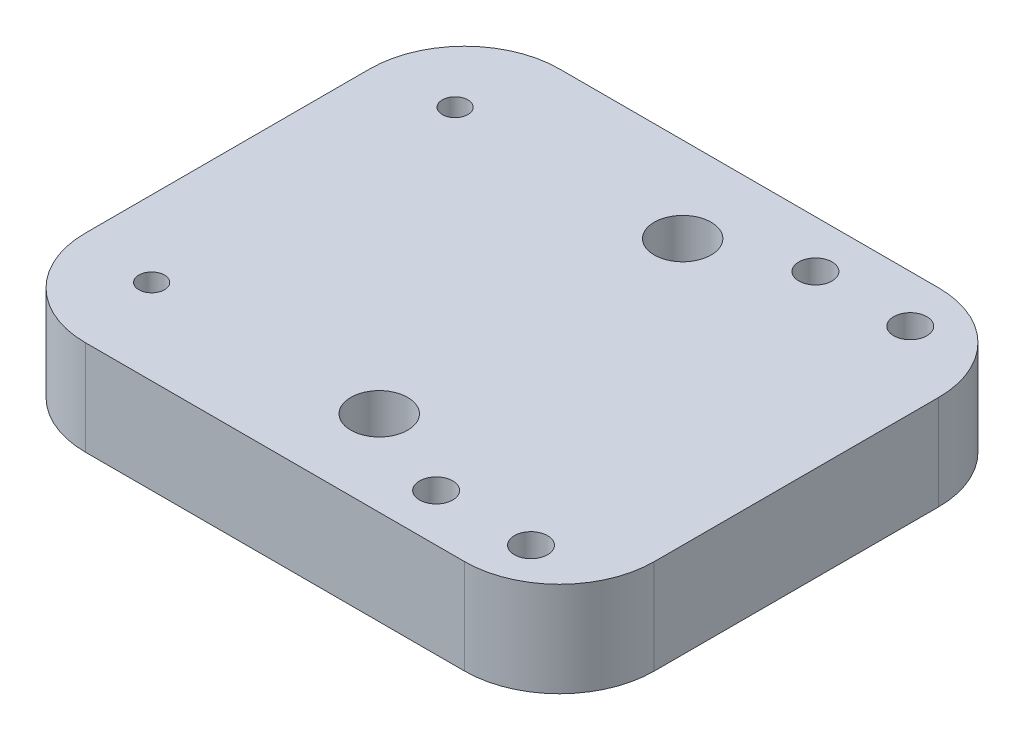
ISO-10303-21;
HEADER;
FILE_DESCRIPTION(('STEP AP214'),'2;1');
FILE_NAME('part.step','',(''),(''),'','','');
FILE_SCHEMA(('AUTOMOTIVE_DESIGN { 1 0 10303 214 1 1 1 1 }'));
ENDSEC;
DATA;
#1=APPLICATION_CONTEXT('core data for automotive mechanical design processes');
#2=APPLICATION_PROTOCOL_DEFINITION('international standard','automotive_design',2000,#1);
#3=PRODUCT_CONTEXT('',#1,'mechanical');
#4=PRODUCT('Part','Part','',(#3));
#5=PRODUCT_RELATED_PRODUCT_CATEGORY('part','',(#4));
#6=PRODUCT_DEFINITION_FORMATION('','',#4);
#7=PRODUCT_DEFINITION_CONTEXT('part definition',#1,'design');
#8=PRODUCT_DEFINITION('design','',#6,#7);
#9=PRODUCT_DEFINITION_SHAPE('','',#8);
#10=(LENGTH_UNIT() NAMED_UNIT(*) SI_UNIT(.MILLI.,.METRE.));
#11=(NAMED_UNIT(*) PLANE_ANGLE_UNIT() SI_UNIT($,.RADIAN.));
#12=(NAMED_UNIT(*) SI_UNIT($,.STERADIAN.) SOLID_ANGLE_UNIT());
#13=UNCERTAINTY_MEASURE_WITH_UNIT(LENGTH_MEASURE(1.E-05),#10,'distance_accuracy_value','');
#14=(GEOMETRIC_REPRESENTATION_CONTEXT(3) GLOBAL_UNCERTAINTY_ASSIGNED_CONTEXT((#13)) GLOBAL_UNIT_ASSIGNED_CONTEXT((#10,
#11,#12)) REPRESENTATION_CONTEXT('',''));
#15=CARTESIAN_POINT('',(0.,0.,0.));
#16=DIRECTION('',(0.,0.,1.));
#17=DIRECTION('',(1.,0.,0.));
#18=AXIS2_PLACEMENT_3D('',#15,#16,#17);
#19=CARTESIAN_POINT('',(32.,0.,-41.));
#20=DIRECTION('',(0.,1.,0.));
#21=DIRECTION('',(0.,0.,1.));
#22=AXIS2_PLACEMENT_3D('',#19,#20,#21);
#23=CYLINDRICAL_SURFACE('',#22,1.35);
#24=CARTESIAN_POINT('',(32.,0.,-41.));
#25=DIRECTION('',(0.,1.,0.));
#26=DIRECTION('',(0.,0.,1.));
#27=AXIS2_PLACEMENT_3D('',#24,#25,#26);
#28=CIRCLE('',#27,1.35);
#29=CARTESIAN_POINT('',(32.,0.,-39.65));
#30=VERTEX_POINT('',#29);
#31=EDGE_CURVE('E208',#30,#30,#28,.T.);
#32=ORIENTED_EDGE('',*,*,#31,.F.);
#33=EDGE_LOOP('',(#32));
#34=FACE_BOUND('',#33,.T.);
#35=CARTESIAN_POINT('',(32.,5.,-41.));
#36=DIRECTION('',(0.,1.,0.));
#37=DIRECTION('',(0.,0.,1.));
#38=AXIS2_PLACEMENT_3D('',#35,#36,#37);
#39=CIRCLE('',#38,1.35);
#40=CARTESIAN_POINT('',(32.,5.,-39.65));
#41=VERTEX_POINT('',#40);
#42=EDGE_CURVE('E43',#41,#41,#39,.F.);
#43=ORIENTED_EDGE('',*,*,#42,.F.);
#44=EDGE_LOOP('',(#43));
#45=FACE_BOUND('',#44,.T.);
#46=ADVANCED_FACE('F39',(#34,#45),#23,.F.);
#47=CARTESIAN_POINT('',(32.,0.,-9.));
#48=DIRECTION('',(0.,1.,0.));
#49=DIRECTION('',(0.,0.,1.));
#50=AXIS2_PLACEMENT_3D('',#47,#48,#49);
#51=CYLINDRICAL_SURFACE('',#50,1.35);
#52=CARTESIAN_POINT('',(32.,0.,-9.));
#53=DIRECTION('',(0.,1.,0.));
#54=DIRECTION('',(0.,0.,1.));
#55=AXIS2_PLACEMENT_3D('',#52,#53,#54);
#56=CIRCLE('',#55,1.35);
#57=CARTESIAN_POINT('',(32.,0.,-7.65));
#58=VERTEX_POINT('',#57);
#59=EDGE_CURVE('E213',#58,#58,#56,.T.);
#60=ORIENTED_EDGE('',*,*,#59,.F.);
#61=EDGE_LOOP('',(#60));
#62=FACE_BOUND('',#61,.T.);
#63=CARTESIAN_POINT('',(32.,5.,-9.));
#64=DIRECTION('',(0.,1.,0.));
#65=DIRECTION('',(0.,0.,1.));
#66=AXIS2_PLACEMENT_3D('',#63,#64,#65);
#67=CIRCLE('',#66,1.35);
#68=CARTESIAN_POINT('',(32.,5.,-7.65));
#69=VERTEX_POINT('',#68);
#70=EDGE_CURVE('E166',#69,#69,#67,.F.);
#71=ORIENTED_EDGE('',*,*,#70,.F.);
#72=EDGE_LOOP('',(#71));
#73=FACE_BOUND('',#72,.T.);
#74=ADVANCED_FACE('F260',(#62,#73),#51,.F.);
#75=CARTESIAN_POINT('',(0.,10.,0.));
#76=DIRECTION('',(1.,0.,0.));
#77=DIRECTION('',(0.,0.,-1.));
#78=AXIS2_PLACEMENT_3D('',#75,#76,#77);
#79=PLANE('',#78);
#80=DIRECTION('',(0.,0.,1.));
#81=VECTOR('',#80,1.);
#82=CARTESIAN_POINT('',(0.,0.,0.));
#83=LINE('',#82,#81);
#84=CARTESIAN_POINT('',(0.,0.,-40.));
#85=VERTEX_POINT('',#84);
#86=CARTESIAN_POINT('',(0.,0.,-10.));
#87=VERTEX_POINT('',#86);
#88=EDGE_CURVE('E134',#85,#87,#83,.T.);
#89=ORIENTED_EDGE('',*,*,#88,.T.);
#90=DIRECTION('',(0.,-1.,0.));
#91=VECTOR('',#90,1.);
#92=CARTESIAN_POINT('',(0.,10.,-10.));
#93=LINE('',#92,#91);
#94=CARTESIAN_POINT('',(0.,10.,-10.));
#95=VERTEX_POINT('',#94);
#96=EDGE_CURVE('E112',#87,#95,#93,.F.);
#97=ORIENTED_EDGE('',*,*,#96,.T.);
#98=DIRECTION('',(0.,0.,1.));
#99=VECTOR('',#98,1.);
#100=CARTESIAN_POINT('',(0.,10.,0.));
#101=LINE('',#100,#99);
#102=CARTESIAN_POINT('',(0.,10.,-40.));
#103=VERTEX_POINT('',#102);
#104=EDGE_CURVE('E144',#103,#95,#101,.T.);
#105=ORIENTED_EDGE('',*,*,#104,.F.);
#106=DIRECTION('',(0.,-1.,0.));
#107=VECTOR('',#106,1.);
#108=CARTESIAN_POINT('',(0.,10.,-40.));
#109=LINE('',#108,#107);
#110=EDGE_CURVE('E117',#103,#85,#109,.T.);
#111=ORIENTED_EDGE('',*,*,#110,.T.);
#112=EDGE_LOOP('',(#89,#97,#105,#111));
#113=FACE_BOUND('',#112,.T.);
#114=ADVANCED_FACE('F238',(#113),#79,.F.);
#115=CARTESIAN_POINT('',(0.,10.,0.));
#116=DIRECTION('',(0.,0.,-1.));
#117=DIRECTION('',(-1.,0.,0.));
#118=AXIS2_PLACEMENT_3D('',#115,#116,#117);
#119=PLANE('',#118);
#120=DIRECTION('',(1.,0.,0.));
#121=VECTOR('',#120,1.);
#122=CARTESIAN_POINT('',(0.,10.,0.));
#123=LINE('',#122,#121);
#124=CARTESIAN_POINT('',(10.,10.,0.));
#125=VERTEX_POINT('',#124);
#126=CARTESIAN_POINT('',(50.,10.,0.));
#127=VERTEX_POINT('',#126);
#128=EDGE_CURVE('E127',#125,#127,#123,.T.);
#129=ORIENTED_EDGE('',*,*,#128,.F.);
#130=DIRECTION('',(0.,-1.,0.));
#131=VECTOR('',#130,1.);
#132=CARTESIAN_POINT('',(10.,10.,0.));
#133=LINE('',#132,#131);
#134=CARTESIAN_POINT('',(10.,0.,0.));
#135=VERTEX_POINT('',#134);
#136=EDGE_CURVE('E111',#125,#135,#133,.T.);
#137=ORIENTED_EDGE('',*,*,#136,.T.);
#138=DIRECTION('',(1.,0.,0.));
#139=VECTOR('',#138,1.);
#140=CARTESIAN_POINT('',(0.,0.,0.));
#141=LINE('',#140,#139);
#142=CARTESIAN_POINT('',(50.,0.,0.));
#143=VERTEX_POINT('',#142);
#144=EDGE_CURVE('E124',#135,#143,#141,.T.);
#145=ORIENTED_EDGE('',*,*,#144,.T.);
#146=DIRECTION('',(0.,-1.,0.));
#147=VECTOR('',#146,1.);
#148=CARTESIAN_POINT('',(50.,10.,0.));
#149=LINE('',#148,#147);
#150=EDGE_CURVE('E129',#143,#127,#149,.F.);
#151=ORIENTED_EDGE('',*,*,#150,.T.);
#152=EDGE_LOOP('',(#129,#137,#145,#151));
#153=FACE_BOUND('',#152,.T.);
#154=ADVANCED_FACE('F123',(#153),#119,.F.);
#155=CARTESIAN_POINT('',(60.,10.,0.));
#156=DIRECTION('',(-1.,0.,0.));
#157=DIRECTION('',(0.,0.,1.));
#158=AXIS2_PLACEMENT_3D('',#155,#156,#157);
#159=PLANE('',#158);
#160=DIRECTION('',(0.,0.,-1.));
#161=VECTOR('',#160,1.);
#162=CARTESIAN_POINT('',(60.,10.,0.));
#163=LINE('',#162,#161);
#164=CARTESIAN_POINT('',(60.,10.,-10.));
#165=VERTEX_POINT('',#164);
#166=CARTESIAN_POINT('',(60.,10.,-40.));
#167=VERTEX_POINT('',#166);
#168=EDGE_CURVE('E230',#165,#167,#163,.T.);
#169=ORIENTED_EDGE('',*,*,#168,.F.);
#170=DIRECTION('',(0.,-1.,0.));
#171=VECTOR('',#170,1.);
#172=CARTESIAN_POINT('',(60.,10.,-10.));
#173=LINE('',#172,#171);
#174=CARTESIAN_POINT('',(60.,0.,-10.));
#175=VERTEX_POINT('',#174);
#176=EDGE_CURVE('E163',#165,#175,#173,.T.);
#177=ORIENTED_EDGE('',*,*,#176,.T.);
#178=DIRECTION('',(0.,0.,-1.));
#179=VECTOR('',#178,1.);
#180=CARTESIAN_POINT('',(60.,0.,0.));
#181=LINE('',#180,#179);
#182=CARTESIAN_POINT('',(60.,0.,-40.));
#183=VERTEX_POINT('',#182);
#184=EDGE_CURVE('E133',#175,#183,#181,.T.);
#185=ORIENTED_EDGE('',*,*,#184,.T.);
#186=DIRECTION('',(0.,-1.,0.));
#187=VECTOR('',#186,1.);
#188=CARTESIAN_POINT('',(60.,10.,-40.));
#189=LINE('',#188,#187);
#190=EDGE_CURVE('E161',#183,#167,#189,.F.);
#191=ORIENTED_EDGE('',*,*,#190,.T.);
#192=EDGE_LOOP('',(#169,#177,#185,#191));
#193=FACE_BOUND('',#192,.T.);
#194=ADVANCED_FACE('F246',(#193),#159,.F.);
#195=CARTESIAN_POINT('',(0.,10.,-50.));
#196=DIRECTION('',(0.,0.,1.));
#197=DIRECTION('',(1.,0.,0.));
#198=AXIS2_PLACEMENT_3D('',#195,#196,#197);
#199=PLANE('',#198);
#200=DIRECTION('',(-1.,0.,0.));
#201=VECTOR('',#200,1.);
#202=CARTESIAN_POINT('',(0.,10.,-50.));
#203=LINE('',#202,#201);
#204=CARTESIAN_POINT('',(50.,10.,-50.));
#205=VERTEX_POINT('',#204);
#206=CARTESIAN_POINT('',(9.99999999999998,10.,-50.));
#207=VERTEX_POINT('',#206);
#208=EDGE_CURVE('E145',#205,#207,#203,.T.);
#209=ORIENTED_EDGE('',*,*,#208,.F.);
#210=DIRECTION('',(0.,-1.,0.));
#211=VECTOR('',#210,1.);
#212=CARTESIAN_POINT('',(50.,10.,-50.));
#213=LINE('',#212,#211);
#214=CARTESIAN_POINT('',(50.,0.,-50.));
#215=VERTEX_POINT('',#214);
#216=EDGE_CURVE('E11',#205,#215,#213,.T.);
#217=ORIENTED_EDGE('',*,*,#216,.T.);
#218=DIRECTION('',(-1.,0.,0.));
#219=VECTOR('',#218,1.);
#220=CARTESIAN_POINT('',(0.,0.,-50.));
#221=LINE('',#220,#219);
#222=CARTESIAN_POINT('',(9.99999999999998,0.,-50.));
#223=VERTEX_POINT('',#222);
#224=EDGE_CURVE('E137',#215,#223,#221,.T.);
#225=ORIENTED_EDGE('',*,*,#224,.T.);
#226=DIRECTION('',(0.,-1.,0.));
#227=VECTOR('',#226,1.);
#228=CARTESIAN_POINT('',(9.99999999999998,10.,-50.));
#229=LINE('',#228,#227);
#230=EDGE_CURVE('E48',#223,#207,#229,.F.);
#231=ORIENTED_EDGE('',*,*,#230,.T.);
#232=EDGE_LOOP('',(#209,#217,#225,#231));
#233=FACE_BOUND('',#232,.T.);
#234=ADVANCED_FACE('F240',(#233),#199,.F.);
#235=CARTESIAN_POINT('',(0.,10.,0.));
#236=DIRECTION('',(0.,-1.,0.));
#237=DIRECTION('',(0.,0.,-1.));
#238=AXIS2_PLACEMENT_3D('',#235,#236,#237);
#239=PLANE('',#238);
#240=CARTESIAN_POINT('',(32.,10.,-41.));
#241=DIRECTION('',(0.,1.,0.));
#242=DIRECTION('',(0.,0.,1.));
#243=AXIS2_PLACEMENT_3D('',#240,#241,#242);
#244=CIRCLE('',#243,3.);
#245=CARTESIAN_POINT('',(32.,10.,-38.));
#246=VERTEX_POINT('',#245);
#247=EDGE_CURVE('E174',#246,#246,#244,.T.);
#248=ORIENTED_EDGE('',*,*,#247,.F.);
#249=EDGE_LOOP('',(#248));
#250=FACE_BOUND('',#249,.T.);
#251=CARTESIAN_POINT('',(32.,10.,-9.));
#252=DIRECTION('',(0.,1.,0.));
#253=DIRECTION('',(0.,0.,1.));
#254=AXIS2_PLACEMENT_3D('',#251,#252,#253);
#255=CIRCLE('',#254,3.);
#256=CARTESIAN_POINT('',(32.,10.,-6.));
#257=VERTEX_POINT('',#256);
#258=EDGE_CURVE('E179',#257,#257,#255,.T.);
#259=ORIENTED_EDGE('',*,*,#258,.F.);
#260=EDGE_LOOP('',(#259));
#261=FACE_BOUND('',#260,.T.);
#262=CARTESIAN_POINT('',(42.,10.,-5.00000000000001));
#263=DIRECTION('',(0.,1.,0.));
#264=DIRECTION('',(0.,0.,1.));
#265=AXIS2_PLACEMENT_3D('',#262,#263,#264);
#266=CIRCLE('',#265,1.74999999999999);
#267=CARTESIAN_POINT('',(42.,10.,-3.25000000000002));
#268=VERTEX_POINT('',#267);
#269=EDGE_CURVE('E172',#268,#268,#266,.T.);
#270=ORIENTED_EDGE('',*,*,#269,.F.);
#271=EDGE_LOOP('',(#270));
#272=FACE_BOUND('',#271,.T.);
#273=CARTESIAN_POINT('',(52.,10.,-5.));
#274=DIRECTION('',(0.,1.,0.));
#275=DIRECTION('',(0.,0.,1.));
#276=AXIS2_PLACEMENT_3D('',#273,#274,#275);
#277=CIRCLE('',#276,1.74999999999999);
#278=CARTESIAN_POINT('',(52.,10.,-3.25000000000001));
#279=VERTEX_POINT('',#278);
#280=EDGE_CURVE('E197',#279,#279,#277,.T.);
#281=ORIENTED_EDGE('',*,*,#280,.F.);
#282=EDGE_LOOP('',(#281));
#283=FACE_BOUND('',#282,.T.);
#284=CARTESIAN_POINT('',(52.,10.,-45.));
#285=DIRECTION('',(0.,1.,0.));
#286=DIRECTION('',(0.,0.,1.));
#287=AXIS2_PLACEMENT_3D('',#284,#285,#286);
#288=CIRCLE('',#287,1.74999999999999);
#289=CARTESIAN_POINT('',(52.,10.,-43.25));
#290=VERTEX_POINT('',#289);
#291=EDGE_CURVE('E191',#290,#290,#288,.T.);
#292=ORIENTED_EDGE('',*,*,#291,.F.);
#293=EDGE_LOOP('',(#292));
#294=FACE_BOUND('',#293,.T.);
#295=CARTESIAN_POINT('',(42.,10.,-45.));
#296=DIRECTION('',(0.,1.,0.));
#297=DIRECTION('',(0.,0.,1.));
#298=AXIS2_PLACEMENT_3D('',#295,#296,#297);
#299=CIRCLE('',#298,1.74999999999999);
#300=CARTESIAN_POINT('',(42.,10.,-43.25));
#301=VERTEX_POINT('',#300);
#302=EDGE_CURVE('E190',#301,#301,#299,.T.);
#303=ORIENTED_EDGE('',*,*,#302,.F.);
#304=EDGE_LOOP('',(#303));
#305=FACE_BOUND('',#304,.T.);
#306=CARTESIAN_POINT('',(7.99999999999998,10.,-41.));
#307=DIRECTION('',(0.,1.,0.));
#308=DIRECTION('',(0.,0.,1.));
#309=AXIS2_PLACEMENT_3D('',#306,#307,#308);
#310=CIRCLE('',#309,1.35);
#311=CARTESIAN_POINT('',(7.99999999999998,10.,-39.65));
#312=VERTEX_POINT('',#311);
#313=EDGE_CURVE('E214',#312,#312,#310,.T.);
#314=ORIENTED_EDGE('',*,*,#313,.F.);
#315=EDGE_LOOP('',(#314));
#316=FACE_BOUND('',#315,.T.);
#317=CARTESIAN_POINT('',(7.99999999999998,10.,-9.));
#318=DIRECTION('',(0.,1.,0.));
#319=DIRECTION('',(0.,0.,1.));
#320=AXIS2_PLACEMENT_3D('',#317,#318,#319);
#321=CIRCLE('',#320,1.35);
#322=CARTESIAN_POINT('',(7.99999999999998,10.,-7.65));
#323=VERTEX_POINT('',#322);
#324=EDGE_CURVE('E217',#323,#323,#321,.T.);
#325=ORIENTED_EDGE('',*,*,#324,.F.);
#326=EDGE_LOOP('',(#325));
#327=FACE_BOUND('',#326,.T.);
#328=ORIENTED_EDGE('',*,*,#104,.T.);
#329=CARTESIAN_POINT('',(10.,10.,-10.));
#330=DIRECTION('',(0.,-1.,0.));
#331=DIRECTION('',(0.,0.,-1.));
#332=AXIS2_PLACEMENT_3D('',#329,#330,#331);
#333=CIRCLE('',#332,10.);
#334=EDGE_CURVE('E159',#95,#125,#333,.F.);
#335=ORIENTED_EDGE('',*,*,#334,.T.);
#336=ORIENTED_EDGE('',*,*,#128,.T.);
#337=CARTESIAN_POINT('',(50.,10.,-10.));
#338=DIRECTION('',(0.,-1.,0.));
#339=DIRECTION('',(0.,0.,-1.));
#340=AXIS2_PLACEMENT_3D('',#337,#338,#339);
#341=CIRCLE('',#340,10.);
#342=EDGE_CURVE('E157',#127,#165,#341,.F.);
#343=ORIENTED_EDGE('',*,*,#342,.T.);
#344=ORIENTED_EDGE('',*,*,#168,.T.);
#345=CARTESIAN_POINT('',(50.,10.,-40.));
#346=DIRECTION('',(0.,-1.,0.));
#347=DIRECTION('',(0.,0.,-1.));
#348=AXIS2_PLACEMENT_3D('',#345,#346,#347);
#349=CIRCLE('',#348,10.);
#350=EDGE_CURVE('E62',#167,#205,#349,.F.);
#351=ORIENTED_EDGE('',*,*,#350,.T.);
#352=ORIENTED_EDGE('',*,*,#208,.T.);
#353=CARTESIAN_POINT('',(9.99999999999998,10.,-40.));
#354=DIRECTION('',(0.,-1.,0.));
#355=DIRECTION('',(0.,0.,-1.));
#356=AXIS2_PLACEMENT_3D('',#353,#354,#355);
#357=CIRCLE('',#356,10.);
#358=EDGE_CURVE('E154',#207,#103,#357,.F.);
#359=ORIENTED_EDGE('',*,*,#358,.T.);
#360=EDGE_LOOP('',(#328,#335,#336,#343,#344,#351,#352,#359));
#361=FACE_BOUND('',#360,.T.);
#362=ADVANCED_FACE('F232',(#250,#261,#272,#283,#294,#305,#316,#327,#361),#239,.F.);
#363=CARTESIAN_POINT('',(0.,0.,0.));
#364=DIRECTION('',(0.,-1.,0.));
#365=DIRECTION('',(0.,0.,-1.));
#366=AXIS2_PLACEMENT_3D('',#363,#364,#365);
#367=PLANE('',#366);
#368=CARTESIAN_POINT('',(42.,0.,-5.00000000000001));
#369=DIRECTION('',(0.,1.,0.));
#370=DIRECTION('',(0.,0.,1.));
#371=AXIS2_PLACEMENT_3D('',#368,#369,#370);
#372=CIRCLE('',#371,1.74999999999999);
#373=CARTESIAN_POINT('',(42.,0.,-3.25000000000002));
#374=VERTEX_POINT('',#373);
#375=EDGE_CURVE('E200',#374,#374,#372,.T.);
#376=ORIENTED_EDGE('',*,*,#375,.T.);
#377=EDGE_LOOP('',(#376));
#378=FACE_BOUND('',#377,.T.);
#379=CARTESIAN_POINT('',(52.,0.,-5.));
#380=DIRECTION('',(0.,1.,0.));
#381=DIRECTION('',(0.,0.,1.));
#382=AXIS2_PLACEMENT_3D('',#379,#380,#381);
#383=CIRCLE('',#382,1.74999999999999);
#384=CARTESIAN_POINT('',(52.,0.,-3.25000000000001));
#385=VERTEX_POINT('',#384);
#386=EDGE_CURVE('E194',#385,#385,#383,.T.);
#387=ORIENTED_EDGE('',*,*,#386,.T.);
#388=EDGE_LOOP('',(#387));
#389=FACE_BOUND('',#388,.T.);
#390=CARTESIAN_POINT('',(52.,0.,-45.));
#391=DIRECTION('',(0.,1.,0.));
#392=DIRECTION('',(0.,0.,1.));
#393=AXIS2_PLACEMENT_3D('',#390,#391,#392);
#394=CIRCLE('',#393,1.74999999999999);
#395=CARTESIAN_POINT('',(52.,0.,-43.25));
#396=VERTEX_POINT('',#395);
#397=EDGE_CURVE('E187',#396,#396,#394,.T.);
#398=ORIENTED_EDGE('',*,*,#397,.T.);
#399=EDGE_LOOP('',(#398));
#400=FACE_BOUND('',#399,.T.);
#401=CARTESIAN_POINT('',(42.,0.,-45.));
#402=DIRECTION('',(0.,1.,0.));
#403=DIRECTION('',(0.,0.,1.));
#404=AXIS2_PLACEMENT_3D('',#401,#402,#403);
#405=CIRCLE('',#404,1.74999999999999);
#406=CARTESIAN_POINT('',(42.,0.,-43.25));
#407=VERTEX_POINT('',#406);
#408=EDGE_CURVE('E205',#407,#407,#405,.T.);
#409=ORIENTED_EDGE('',*,*,#408,.T.);
#410=EDGE_LOOP('',(#409));
#411=FACE_BOUND('',#410,.T.);
#412=CARTESIAN_POINT('',(7.99999999999998,0.,-41.));
#413=DIRECTION('',(0.,1.,0.));
#414=DIRECTION('',(0.,0.,1.));
#415=AXIS2_PLACEMENT_3D('',#412,#413,#414);
#416=CIRCLE('',#415,1.35);
#417=CARTESIAN_POINT('',(7.99999999999998,0.,-39.65));
#418=VERTEX_POINT('',#417);
#419=EDGE_CURVE('E218',#418,#418,#416,.T.);
#420=ORIENTED_EDGE('',*,*,#419,.T.);
#421=EDGE_LOOP('',(#420));
#422=FACE_BOUND('',#421,.T.);
#423=ORIENTED_EDGE('',*,*,#59,.T.);
#424=EDGE_LOOP('',(#423));
#425=FACE_BOUND('',#424,.T.);
#426=ORIENTED_EDGE('',*,*,#31,.T.);
#427=EDGE_LOOP('',(#426));
#428=FACE_BOUND('',#427,.T.);
#429=CARTESIAN_POINT('',(7.99999999999998,0.,-9.));
#430=DIRECTION('',(0.,1.,0.));
#431=DIRECTION('',(0.,0.,1.));
#432=AXIS2_PLACEMENT_3D('',#429,#430,#431);
#433=CIRCLE('',#432,1.35);
#434=CARTESIAN_POINT('',(7.99999999999998,0.,-7.65));
#435=VERTEX_POINT('',#434);
#436=EDGE_CURVE('E139',#435,#435,#433,.T.);
#437=ORIENTED_EDGE('',*,*,#436,.T.);
#438=EDGE_LOOP('',(#437));
#439=FACE_BOUND('',#438,.T.);
#440=ORIENTED_EDGE('',*,*,#144,.F.);
#441=CARTESIAN_POINT('',(10.,0.,-10.));
#442=DIRECTION('',(0.,-1.,0.));
#443=DIRECTION('',(0.,0.,-1.));
#444=AXIS2_PLACEMENT_3D('',#441,#442,#443);
#445=CIRCLE('',#444,10.);
#446=EDGE_CURVE('E107',#135,#87,#445,.T.);
#447=ORIENTED_EDGE('',*,*,#446,.T.);
#448=ORIENTED_EDGE('',*,*,#88,.F.);
#449=CARTESIAN_POINT('',(9.99999999999998,0.,-40.));
#450=DIRECTION('',(0.,-1.,0.));
#451=DIRECTION('',(0.,0.,-1.));
#452=AXIS2_PLACEMENT_3D('',#449,#450,#451);
#453=CIRCLE('',#452,10.);
#454=EDGE_CURVE('E128',#85,#223,#453,.T.);
#455=ORIENTED_EDGE('',*,*,#454,.T.);
#456=ORIENTED_EDGE('',*,*,#224,.F.);
#457=CARTESIAN_POINT('',(50.,0.,-40.));
#458=DIRECTION('',(0.,-1.,0.));
#459=DIRECTION('',(0.,0.,-1.));
#460=AXIS2_PLACEMENT_3D('',#457,#458,#459);
#461=CIRCLE('',#460,10.);
#462=EDGE_CURVE('E148',#215,#183,#461,.T.);
#463=ORIENTED_EDGE('',*,*,#462,.T.);
#464=ORIENTED_EDGE('',*,*,#184,.F.);
#465=CARTESIAN_POINT('',(50.,0.,-10.));
#466=DIRECTION('',(0.,-1.,0.));
#467=DIRECTION('',(0.,0.,-1.));
#468=AXIS2_PLACEMENT_3D('',#465,#466,#467);
#469=CIRCLE('',#468,10.);
#470=EDGE_CURVE('E118',#175,#143,#469,.T.);
#471=ORIENTED_EDGE('',*,*,#470,.T.);
#472=EDGE_LOOP('',(#440,#447,#448,#455,#456,#463,#464,#471));
#473=FACE_BOUND('',#472,.T.);
#474=ADVANCED_FACE('F131',(#378,#389,#400,#411,#422,#425,#428,#439,#473),#367,.T.);
#475=CARTESIAN_POINT('',(7.99999999999998,0.,-9.));
#476=DIRECTION('',(0.,1.,0.));
#477=DIRECTION('',(0.,0.,1.));
#478=AXIS2_PLACEMENT_3D('',#475,#476,#477);
#479=CYLINDRICAL_SURFACE('',#478,1.35);
#480=ORIENTED_EDGE('',*,*,#436,.F.);
#481=EDGE_LOOP('',(#480));
#482=FACE_BOUND('',#481,.T.);
#483=ORIENTED_EDGE('',*,*,#324,.T.);
#484=EDGE_LOOP('',(#483));
#485=FACE_BOUND('',#484,.T.);
#486=ADVANCED_FACE('F277',(#482,#485),#479,.F.);
#487=CARTESIAN_POINT('',(7.99999999999998,0.,-41.));
#488=DIRECTION('',(0.,1.,0.));
#489=DIRECTION('',(0.,0.,1.));
#490=AXIS2_PLACEMENT_3D('',#487,#488,#489);
#491=CYLINDRICAL_SURFACE('',#490,1.35);
#492=ORIENTED_EDGE('',*,*,#419,.F.);
#493=EDGE_LOOP('',(#492));
#494=FACE_BOUND('',#493,.T.);
#495=ORIENTED_EDGE('',*,*,#313,.T.);
#496=EDGE_LOOP('',(#495));
#497=FACE_BOUND('',#496,.T.);
#498=ADVANCED_FACE('F275',(#494,#497),#491,.F.);
#499=CARTESIAN_POINT('',(42.,0.,-45.));
#500=DIRECTION('',(0.,1.,0.));
#501=DIRECTION('',(0.,0.,1.));
#502=AXIS2_PLACEMENT_3D('',#499,#500,#501);
#503=CYLINDRICAL_SURFACE('',#502,1.74999999999999);
#504=ORIENTED_EDGE('',*,*,#408,.F.);
#505=EDGE_LOOP('',(#504));
#506=FACE_BOUND('',#505,.T.);
#507=ORIENTED_EDGE('',*,*,#302,.T.);
#508=EDGE_LOOP('',(#507));
#509=FACE_BOUND('',#508,.T.);
#510=ADVANCED_FACE('F273',(#506,#509),#503,.F.);
#511=CARTESIAN_POINT('',(52.,0.,-45.));
#512=DIRECTION('',(0.,1.,0.));
#513=DIRECTION('',(0.,0.,1.));
#514=AXIS2_PLACEMENT_3D('',#511,#512,#513);
#515=CYLINDRICAL_SURFACE('',#514,1.74999999999999);
#516=ORIENTED_EDGE('',*,*,#397,.F.);
#517=EDGE_LOOP('',(#516));
#518=FACE_BOUND('',#517,.T.);
#519=ORIENTED_EDGE('',*,*,#291,.T.);
#520=EDGE_LOOP('',(#519));
#521=FACE_BOUND('',#520,.T.);
#522=ADVANCED_FACE('F403',(#518,#521),#515,.F.);
#523=CARTESIAN_POINT('',(52.,0.,-5.));
#524=DIRECTION('',(0.,1.,0.));
#525=DIRECTION('',(0.,0.,1.));
#526=AXIS2_PLACEMENT_3D('',#523,#524,#525);
#527=CYLINDRICAL_SURFACE('',#526,1.74999999999999);
#528=ORIENTED_EDGE('',*,*,#386,.F.);
#529=EDGE_LOOP('',(#528));
#530=FACE_BOUND('',#529,.T.);
#531=ORIENTED_EDGE('',*,*,#280,.T.);
#532=EDGE_LOOP('',(#531));
#533=FACE_BOUND('',#532,.T.);
#534=ADVANCED_FACE('F406',(#530,#533),#527,.F.);
#535=CARTESIAN_POINT('',(42.,0.,-5.00000000000001));
#536=DIRECTION('',(0.,1.,0.));
#537=DIRECTION('',(0.,0.,1.));
#538=AXIS2_PLACEMENT_3D('',#535,#536,#537);
#539=CYLINDRICAL_SURFACE('',#538,1.74999999999999);
#540=ORIENTED_EDGE('',*,*,#375,.F.);
#541=EDGE_LOOP('',(#540));
#542=FACE_BOUND('',#541,.T.);
#543=ORIENTED_EDGE('',*,*,#269,.T.);
#544=EDGE_LOOP('',(#543));
#545=FACE_BOUND('',#544,.T.);
#546=ADVANCED_FACE('F257',(#542,#545),#539,.F.);
#547=CARTESIAN_POINT('',(10.,10.,-10.));
#548=DIRECTION('',(0.,-1.,0.));
#549=DIRECTION('',(0.,0.,-1.));
#550=AXIS2_PLACEMENT_3D('',#547,#548,#549);
#551=CYLINDRICAL_SURFACE('',#550,10.);
#552=ORIENTED_EDGE('',*,*,#334,.F.);
#553=ORIENTED_EDGE('',*,*,#96,.F.);
#554=ORIENTED_EDGE('',*,*,#446,.F.);
#555=ORIENTED_EDGE('',*,*,#136,.F.);
#556=EDGE_LOOP('',(#552,#553,#554,#555));
#557=FACE_BOUND('',#556,.T.);
#558=ADVANCED_FACE('F110',(#557),#551,.T.);
#559=CARTESIAN_POINT('',(50.,10.,-10.));
#560=DIRECTION('',(0.,-1.,0.));
#561=DIRECTION('',(0.,0.,-1.));
#562=AXIS2_PLACEMENT_3D('',#559,#560,#561);
#563=CYLINDRICAL_SURFACE('',#562,10.);
#564=ORIENTED_EDGE('',*,*,#342,.F.);
#565=ORIENTED_EDGE('',*,*,#150,.F.);
#566=ORIENTED_EDGE('',*,*,#470,.F.);
#567=ORIENTED_EDGE('',*,*,#176,.F.);
#568=EDGE_LOOP('',(#564,#565,#566,#567));
#569=FACE_BOUND('',#568,.T.);
#570=ADVANCED_FACE('F250',(#569),#563,.T.);
#571=CARTESIAN_POINT('',(50.,10.,-40.));
#572=DIRECTION('',(0.,-1.,0.));
#573=DIRECTION('',(0.,0.,-1.));
#574=AXIS2_PLACEMENT_3D('',#571,#572,#573);
#575=CYLINDRICAL_SURFACE('',#574,10.);
#576=ORIENTED_EDGE('',*,*,#350,.F.);
#577=ORIENTED_EDGE('',*,*,#190,.F.);
#578=ORIENTED_EDGE('',*,*,#462,.F.);
#579=ORIENTED_EDGE('',*,*,#216,.F.);
#580=EDGE_LOOP('',(#576,#577,#578,#579));
#581=FACE_BOUND('',#580,.T.);
#582=ADVANCED_FACE('F242',(#581),#575,.T.);
#583=CARTESIAN_POINT('',(9.99999999999998,10.,-40.));
#584=DIRECTION('',(0.,-1.,0.));
#585=DIRECTION('',(0.,0.,-1.));
#586=AXIS2_PLACEMENT_3D('',#583,#584,#585);
#587=CYLINDRICAL_SURFACE('',#586,10.);
#588=ORIENTED_EDGE('',*,*,#358,.F.);
#589=ORIENTED_EDGE('',*,*,#230,.F.);
#590=ORIENTED_EDGE('',*,*,#454,.F.);
#591=ORIENTED_EDGE('',*,*,#110,.F.);
#592=EDGE_LOOP('',(#588,#589,#590,#591));
#593=FACE_BOUND('',#592,.T.);
#594=ADVANCED_FACE('F41',(#593),#587,.T.);
#595=CARTESIAN_POINT('',(32.,5.,-9.));
#596=DIRECTION('',(0.,1.,0.));
#597=DIRECTION('',(0.,0.,1.));
#598=AXIS2_PLACEMENT_3D('',#595,#596,#597);
#599=PLANE('',#598);
#600=CARTESIAN_POINT('',(32.,5.,-9.));
#601=DIRECTION('',(0.,1.,0.));
#602=DIRECTION('',(0.,0.,1.));
#603=AXIS2_PLACEMENT_3D('',#600,#601,#602);
#604=CIRCLE('',#603,3.);
#605=CARTESIAN_POINT('',(32.,5.,-6.));
#606=VERTEX_POINT('',#605);
#607=EDGE_CURVE('E184',#606,#606,#604,.T.);
#608=ORIENTED_EDGE('',*,*,#607,.T.);
#609=EDGE_LOOP('',(#608));
#610=FACE_BOUND('',#609,.T.);
#611=ORIENTED_EDGE('',*,*,#70,.T.);
#612=EDGE_LOOP('',(#611));
#613=FACE_BOUND('',#612,.T.);
#614=ADVANCED_FACE('F352',(#610,#613),#599,.T.);
#615=CARTESIAN_POINT('',(32.,5.,-9.));
#616=DIRECTION('',(0.,1.,0.));
#617=DIRECTION('',(0.,0.,1.));
#618=AXIS2_PLACEMENT_3D('',#615,#616,#617);
#619=CYLINDRICAL_SURFACE('',#618,3.);
#620=ORIENTED_EDGE('',*,*,#607,.F.);
#621=EDGE_LOOP('',(#620));
#622=FACE_BOUND('',#621,.T.);
#623=ORIENTED_EDGE('',*,*,#258,.T.);
#624=EDGE_LOOP('',(#623));
#625=FACE_BOUND('',#624,.T.);
#626=ADVANCED_FACE('F369',(#622,#625),#619,.F.);
#627=CARTESIAN_POINT('',(32.,5.,-41.));
#628=DIRECTION('',(0.,1.,0.));
#629=DIRECTION('',(0.,0.,1.));
#630=AXIS2_PLACEMENT_3D('',#627,#628,#629);
#631=PLANE('',#630);
#632=CARTESIAN_POINT('',(32.,5.,-41.));
#633=DIRECTION('',(0.,1.,0.));
#634=DIRECTION('',(0.,0.,1.));
#635=AXIS2_PLACEMENT_3D('',#632,#633,#634);
#636=CIRCLE('',#635,3.);
#637=CARTESIAN_POINT('',(32.,5.,-38.));
#638=VERTEX_POINT('',#637);
#639=EDGE_CURVE('E168',#638,#638,#636,.T.);
#640=ORIENTED_EDGE('',*,*,#639,.T.);
#641=EDGE_LOOP('',(#640));
#642=FACE_BOUND('',#641,.T.);
#643=ORIENTED_EDGE('',*,*,#42,.T.);
#644=EDGE_LOOP('',(#643));
#645=FACE_BOUND('',#644,.T.);
#646=ADVANCED_FACE('F379',(#642,#645),#631,.T.);
#647=CARTESIAN_POINT('',(32.,5.,-41.));
#648=DIRECTION('',(0.,1.,0.));
#649=DIRECTION('',(0.,0.,1.));
#650=AXIS2_PLACEMENT_3D('',#647,#648,#649);
#651=CYLINDRICAL_SURFACE('',#650,3.);
#652=ORIENTED_EDGE('',*,*,#639,.F.);
#653=EDGE_LOOP('',(#652));
#654=FACE_BOUND('',#653,.T.);
#655=ORIENTED_EDGE('',*,*,#247,.T.);
#656=EDGE_LOOP('',(#655));
#657=FACE_BOUND('',#656,.T.);
#658=ADVANCED_FACE('F389',(#654,#657),#651,.F.);
#659=CLOSED_SHELL('',(#46,#74,#114,#154,#194,#234,#362,#474,#486,#498,#510,#522,#534,#546,#558,
#570,#582,#594,#614,#626,#646,#658));
#660=MANIFOLD_SOLID_BREP('B2',#659);
#661=ADVANCED_BREP_SHAPE_REPRESENTATION('',(#18,#660),#14);
#662=SHAPE_DEFINITION_REPRESENTATION(#9,#661);
ENDSEC;
END-ISO-10303-21;
